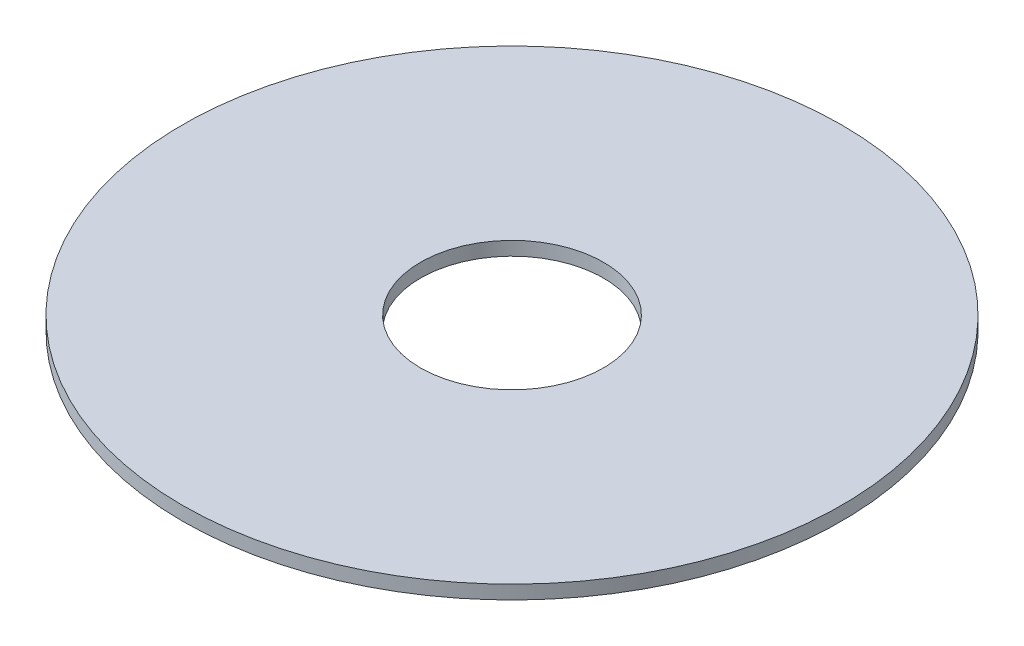
ISO-10303-21;
HEADER;
FILE_DESCRIPTION(('STEP AP214'),'2;1');
FILE_NAME('part.step','',(''),(''),'','','');
FILE_SCHEMA(('AUTOMOTIVE_DESIGN { 1 0 10303 214 1 1 1 1 }'));
ENDSEC;
DATA;
#1=APPLICATION_CONTEXT('core data for automotive mechanical design processes');
#2=APPLICATION_PROTOCOL_DEFINITION('international standard','automotive_design',2000,#1);
#3=PRODUCT_CONTEXT('',#1,'mechanical');
#4=PRODUCT('Part','Part','',(#3));
#5=PRODUCT_RELATED_PRODUCT_CATEGORY('part','',(#4));
#6=PRODUCT_DEFINITION_FORMATION('','',#4);
#7=PRODUCT_DEFINITION_CONTEXT('part definition',#1,'design');
#8=PRODUCT_DEFINITION('design','',#6,#7);
#9=PRODUCT_DEFINITION_SHAPE('','',#8);
#10=(LENGTH_UNIT() NAMED_UNIT(*) SI_UNIT(.MILLI.,.METRE.));
#11=(NAMED_UNIT(*) PLANE_ANGLE_UNIT() SI_UNIT($,.RADIAN.));
#12=(NAMED_UNIT(*) SI_UNIT($,.STERADIAN.) SOLID_ANGLE_UNIT());
#13=UNCERTAINTY_MEASURE_WITH_UNIT(LENGTH_MEASURE(1.E-05),#10,'distance_accuracy_value','');
#14=(GEOMETRIC_REPRESENTATION_CONTEXT(3) GLOBAL_UNCERTAINTY_ASSIGNED_CONTEXT((#13)) GLOBAL_UNIT_ASSIGNED_CONTEXT((#10,
#11,#12)) REPRESENTATION_CONTEXT('',''));
#15=CARTESIAN_POINT('',(0.,0.,0.));
#16=DIRECTION('',(0.,0.,1.));
#17=DIRECTION('',(1.,0.,0.));
#18=AXIS2_PLACEMENT_3D('',#15,#16,#17);
#19=CARTESIAN_POINT('',(0.,0.75,0.));
#20=DIRECTION('',(0.,1.,0.));
#21=DIRECTION('',(0.,0.,1.));
#22=AXIS2_PLACEMENT_3D('',#19,#20,#21);
#23=PLANE('',#22);
#24=CARTESIAN_POINT('',(0.,0.75,0.));
#25=DIRECTION('',(0.,1.,0.));
#26=DIRECTION('',(0.,0.,1.));
#27=AXIS2_PLACEMENT_3D('',#24,#25,#26);
#28=CIRCLE('',#27,18.);
#29=CARTESIAN_POINT('',(0.,0.75,18.));
#30=VERTEX_POINT('',#29);
#31=EDGE_CURVE('E10',#30,#30,#28,.T.);
#32=ORIENTED_EDGE('',*,*,#31,.T.);
#33=EDGE_LOOP('',(#32));
#34=FACE_BOUND('',#33,.T.);
#35=CARTESIAN_POINT('',(0.,0.75,0.));
#36=DIRECTION('',(0.,1.,0.));
#37=DIRECTION('',(0.,0.,1.));
#38=AXIS2_PLACEMENT_3D('',#35,#36,#37);
#39=CIRCLE('',#38,5.);
#40=CARTESIAN_POINT('',(0.,0.75,5.));
#41=VERTEX_POINT('',#40);
#42=EDGE_CURVE('E48',#41,#41,#39,.T.);
#43=ORIENTED_EDGE('',*,*,#42,.F.);
#44=EDGE_LOOP('',(#43));
#45=FACE_BOUND('',#44,.T.);
#46=ADVANCED_FACE('F37',(#34,#45),#23,.T.);
#47=CARTESIAN_POINT('',(0.,0.,0.));
#48=DIRECTION('',(0.,1.,0.));
#49=DIRECTION('',(0.,0.,1.));
#50=AXIS2_PLACEMENT_3D('',#47,#48,#49);
#51=PLANE('',#50);
#52=CARTESIAN_POINT('',(0.,0.,0.));
#53=DIRECTION('',(0.,1.,0.));
#54=DIRECTION('',(0.,0.,1.));
#55=AXIS2_PLACEMENT_3D('',#52,#53,#54);
#56=CIRCLE('',#55,18.);
#57=CARTESIAN_POINT('',(0.,0.,18.));
#58=VERTEX_POINT('',#57);
#59=EDGE_CURVE('E41',#58,#58,#56,.T.);
#60=ORIENTED_EDGE('',*,*,#59,.F.);
#61=EDGE_LOOP('',(#60));
#62=FACE_BOUND('',#61,.T.);
#63=CARTESIAN_POINT('',(0.,0.,0.));
#64=DIRECTION('',(0.,1.,0.));
#65=DIRECTION('',(0.,0.,1.));
#66=AXIS2_PLACEMENT_3D('',#63,#64,#65);
#67=CIRCLE('',#66,5.);
#68=CARTESIAN_POINT('',(0.,0.,5.));
#69=VERTEX_POINT('',#68);
#70=EDGE_CURVE('E50',#69,#69,#67,.T.);
#71=ORIENTED_EDGE('',*,*,#70,.T.);
#72=EDGE_LOOP('',(#71));
#73=FACE_BOUND('',#72,.T.);
#74=ADVANCED_FACE('F60',(#62,#73),#51,.F.);
#75=CARTESIAN_POINT('',(0.,0.75,0.));
#76=DIRECTION('',(0.,-1.,0.));
#77=DIRECTION('',(0.,0.,-1.));
#78=AXIS2_PLACEMENT_3D('',#75,#76,#77);
#79=CYLINDRICAL_SURFACE('',#78,18.);
#80=ORIENTED_EDGE('',*,*,#31,.F.);
#81=EDGE_LOOP('',(#80));
#82=FACE_BOUND('',#81,.T.);
#83=ORIENTED_EDGE('',*,*,#59,.T.);
#84=EDGE_LOOP('',(#83));
#85=FACE_BOUND('',#84,.T.);
#86=ADVANCED_FACE('F39',(#82,#85),#79,.T.);
#87=CARTESIAN_POINT('',(0.,0.75,0.));
#88=DIRECTION('',(0.,-1.,0.));
#89=DIRECTION('',(0.,0.,-1.));
#90=AXIS2_PLACEMENT_3D('',#87,#88,#89);
#91=CYLINDRICAL_SURFACE('',#90,5.);
#92=ORIENTED_EDGE('',*,*,#42,.T.);
#93=EDGE_LOOP('',(#92));
#94=FACE_BOUND('',#93,.T.);
#95=ORIENTED_EDGE('',*,*,#70,.F.);
#96=EDGE_LOOP('',(#95));
#97=FACE_BOUND('',#96,.T.);
#98=ADVANCED_FACE('F56',(#94,#97),#91,.F.);
#99=CLOSED_SHELL('',(#46,#74,#86,#98));
#100=MANIFOLD_SOLID_BREP('B2',#99);
#101=ADVANCED_BREP_SHAPE_REPRESENTATION('',(#18,#100),#14);
#102=SHAPE_DEFINITION_REPRESENTATION(#9,#101);
ENDSEC;
END-ISO-10303-21;
